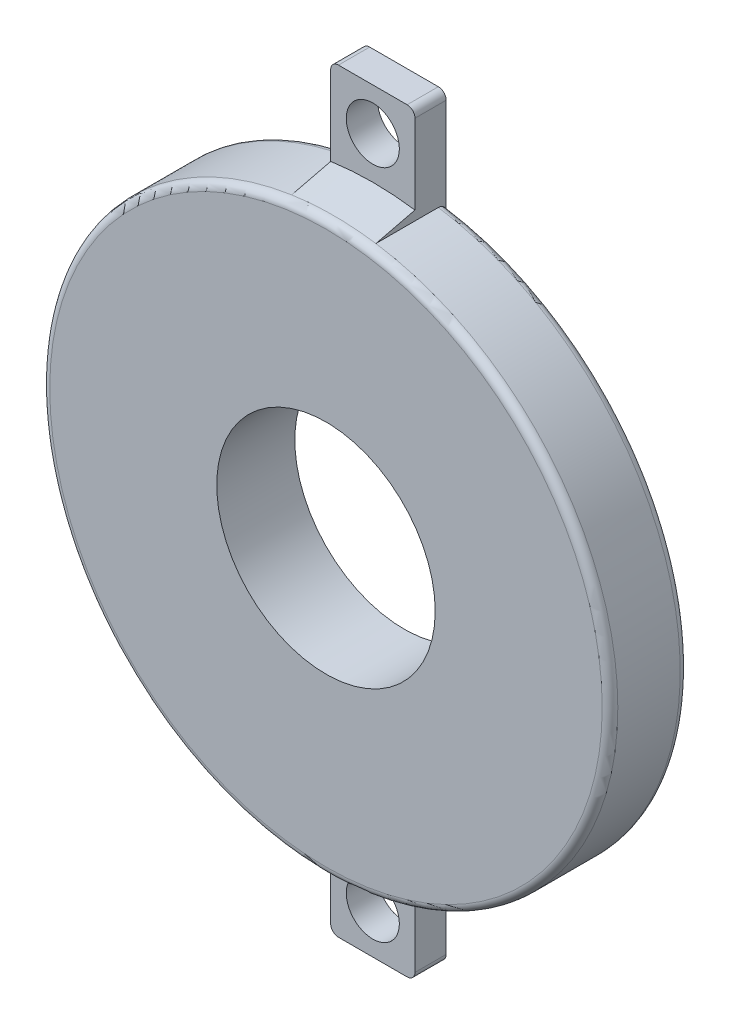
ISO-10303-21;
HEADER;
FILE_DESCRIPTION(('STEP AP214'),'2;1');
FILE_NAME('part.step','',(''),(''),'','','');
FILE_SCHEMA(('AUTOMOTIVE_DESIGN { 1 0 10303 214 1 1 1 1 }'));
ENDSEC;
DATA;
#1=APPLICATION_CONTEXT('core data for automotive mechanical design processes');
#2=APPLICATION_PROTOCOL_DEFINITION('international standard','automotive_design',2000,#1);
#3=PRODUCT_CONTEXT('',#1,'mechanical');
#4=PRODUCT('Part','Part','',(#3));
#5=PRODUCT_RELATED_PRODUCT_CATEGORY('part','',(#4));
#6=PRODUCT_DEFINITION_FORMATION('','',#4);
#7=PRODUCT_DEFINITION_CONTEXT('part definition',#1,'design');
#8=PRODUCT_DEFINITION('design','',#6,#7);
#9=PRODUCT_DEFINITION_SHAPE('','',#8);
#10=(LENGTH_UNIT() NAMED_UNIT(*) SI_UNIT(.MILLI.,.METRE.));
#11=(NAMED_UNIT(*) PLANE_ANGLE_UNIT() SI_UNIT($,.RADIAN.));
#12=(NAMED_UNIT(*) SI_UNIT($,.STERADIAN.) SOLID_ANGLE_UNIT());
#13=UNCERTAINTY_MEASURE_WITH_UNIT(LENGTH_MEASURE(1.E-05),#10,'distance_accuracy_value','');
#14=(GEOMETRIC_REPRESENTATION_CONTEXT(3) GLOBAL_UNCERTAINTY_ASSIGNED_CONTEXT((#13)) GLOBAL_UNIT_ASSIGNED_CONTEXT((#10,
#11,#12)) REPRESENTATION_CONTEXT('',''));
#15=CARTESIAN_POINT('',(0.,0.,0.));
#16=DIRECTION('',(0.,0.,1.));
#17=DIRECTION('',(1.,0.,0.));
#18=AXIS2_PLACEMENT_3D('',#15,#16,#17);
#19=CARTESIAN_POINT('',(0.,0.,5.));
#20=DIRECTION('',(0.,0.,-1.));
#21=DIRECTION('',(-1.,0.,0.));
#22=AXIS2_PLACEMENT_3D('',#19,#20,#21);
#23=CYLINDRICAL_SURFACE('',#22,18.2);
#24=CARTESIAN_POINT('',(0.,0.,4.5));
#25=DIRECTION('',(0.,0.,1.));
#26=DIRECTION('',(1.,0.,0.));
#27=AXIS2_PLACEMENT_3D('',#24,#25,#26);
#28=CIRCLE('',#27,18.2);
#29=CARTESIAN_POINT('',(-2.7,-17.9986110575233,4.5));
#30=VERTEX_POINT('',#29);
#31=CARTESIAN_POINT('',(-2.7,17.9986110575233,4.5));
#32=VERTEX_POINT('',#31);
#33=EDGE_CURVE('E313',#30,#32,#28,.F.);
#34=ORIENTED_EDGE('',*,*,#33,.T.);
#35=DIRECTION('',(0.,0.,-1.));
#36=VECTOR('',#35,1.);
#37=CARTESIAN_POINT('',(-2.7,17.9986110575233,2.));
#38=LINE('',#37,#36);
#39=CARTESIAN_POINT('',(-2.7,17.9986110575233,0.5));
#40=VERTEX_POINT('',#39);
#41=EDGE_CURVE('E237',#32,#40,#38,.T.);
#42=ORIENTED_EDGE('',*,*,#41,.T.);
#43=CARTESIAN_POINT('',(0.,0.,0.5));
#44=DIRECTION('',(0.,0.,1.));
#45=DIRECTION('',(1.,0.,0.));
#46=AXIS2_PLACEMENT_3D('',#43,#44,#45);
#47=CIRCLE('',#46,18.2);
#48=CARTESIAN_POINT('',(-2.7,-17.9986110575233,0.5));
#49=VERTEX_POINT('',#48);
#50=EDGE_CURVE('E312',#40,#49,#47,.T.);
#51=ORIENTED_EDGE('',*,*,#50,.T.);
#52=DIRECTION('',(0.,0.,-1.));
#53=VECTOR('',#52,1.);
#54=CARTESIAN_POINT('',(-2.7,-17.9986110575233,2.));
#55=LINE('',#54,#53);
#56=EDGE_CURVE('E215',#30,#49,#55,.T.);
#57=ORIENTED_EDGE('',*,*,#56,.F.);
#58=EDGE_LOOP('',(#34,#42,#51,#57));
#59=FACE_BOUND('',#58,.T.);
#60=ADVANCED_FACE('F49',(#59),#23,.T.);
#61=DIRECTION('',(0.,0.,-1.));
#62=VECTOR('',#61,1.);
#63=CARTESIAN_POINT('',(2.7,17.9986110575233,2.));
#64=LINE('',#63,#62);
#65=CARTESIAN_POINT('',(2.7,17.9986110575233,4.5));
#66=VERTEX_POINT('',#65);
#67=CARTESIAN_POINT('',(2.7,17.9986110575233,0.5));
#68=VERTEX_POINT('',#67);
#69=EDGE_CURVE('E255',#66,#68,#64,.T.);
#70=ORIENTED_EDGE('',*,*,#69,.F.);
#71=CARTESIAN_POINT('',(2.7,-17.9986110575233,4.5));
#72=VERTEX_POINT('',#71);
#73=EDGE_CURVE('E307',#66,#72,#28,.F.);
#74=ORIENTED_EDGE('',*,*,#73,.T.);
#75=DIRECTION('',(0.,0.,-1.));
#76=VECTOR('',#75,1.);
#77=CARTESIAN_POINT('',(2.7,-17.9986110575233,2.));
#78=LINE('',#77,#76);
#79=CARTESIAN_POINT('',(2.7,-17.9986110575233,0.5));
#80=VERTEX_POINT('',#79);
#81=EDGE_CURVE('E211',#72,#80,#78,.T.);
#82=ORIENTED_EDGE('',*,*,#81,.T.);
#83=CARTESIAN_POINT('',(0.,0.,0.5));
#84=DIRECTION('',(0.,0.,1.));
#85=DIRECTION('',(1.,0.,0.));
#86=AXIS2_PLACEMENT_3D('',#83,#84,#85);
#87=CIRCLE('',#86,18.2);
#88=EDGE_CURVE('E317',#80,#68,#87,.T.);
#89=ORIENTED_EDGE('',*,*,#88,.T.);
#90=EDGE_LOOP('',(#70,#74,#82,#89));
#91=FACE_BOUND('',#90,.T.);
#92=ADVANCED_FACE('F422',(#91),#23,.T.);
#93=CARTESIAN_POINT('',(0.,0.,5.));
#94=DIRECTION('',(0.,0.,-1.));
#95=DIRECTION('',(-1.,0.,0.));
#96=AXIS2_PLACEMENT_3D('',#93,#94,#95);
#97=CYLINDRICAL_SURFACE('',#96,7.);
#98=CARTESIAN_POINT('',(0.,0.,5.));
#99=DIRECTION('',(0.,0.,1.));
#100=DIRECTION('',(1.,0.,0.));
#101=AXIS2_PLACEMENT_3D('',#98,#99,#100);
#102=CIRCLE('',#101,7.);
#103=CARTESIAN_POINT('',(7.,0.,5.));
#104=VERTEX_POINT('',#103);
#105=EDGE_CURVE('E191',#104,#104,#102,.T.);
#106=ORIENTED_EDGE('',*,*,#105,.T.);
#107=EDGE_LOOP('',(#106));
#108=FACE_BOUND('',#107,.T.);
#109=CARTESIAN_POINT('',(0.,0.,0.));
#110=DIRECTION('',(0.,0.,1.));
#111=DIRECTION('',(1.,0.,0.));
#112=AXIS2_PLACEMENT_3D('',#109,#110,#111);
#113=CIRCLE('',#112,7.);
#114=CARTESIAN_POINT('',(7.,0.,0.));
#115=VERTEX_POINT('',#114);
#116=EDGE_CURVE('E220',#115,#115,#113,.T.);
#117=ORIENTED_EDGE('',*,*,#116,.F.);
#118=EDGE_LOOP('',(#117));
#119=FACE_BOUND('',#118,.T.);
#120=ADVANCED_FACE('F428',(#108,#119),#97,.F.);
#121=CARTESIAN_POINT('',(0.,0.,5.));
#122=DIRECTION('',(0.,0.,1.));
#123=DIRECTION('',(1.,0.,0.));
#124=AXIS2_PLACEMENT_3D('',#121,#122,#123);
#125=PLANE('',#124);
#126=CARTESIAN_POINT('',(0.,0.,5.));
#127=DIRECTION('',(0.,0.,1.));
#128=DIRECTION('',(1.,0.,0.));
#129=AXIS2_PLACEMENT_3D('',#126,#127,#128);
#130=CIRCLE('',#129,17.7);
#131=CARTESIAN_POINT('',(17.7,0.,5.));
#132=VERTEX_POINT('',#131);
#133=EDGE_CURVE('E327',#132,#132,#130,.T.);
#134=ORIENTED_EDGE('',*,*,#133,.T.);
#135=EDGE_LOOP('',(#134));
#136=FACE_BOUND('',#135,.T.);
#137=ORIENTED_EDGE('',*,*,#105,.F.);
#138=EDGE_LOOP('',(#137));
#139=FACE_BOUND('',#138,.T.);
#140=ADVANCED_FACE('F436',(#136,#139),#125,.T.);
#141=CARTESIAN_POINT('',(0.,0.,0.));
#142=DIRECTION('',(0.,0.,1.));
#143=DIRECTION('',(1.,0.,0.));
#144=AXIS2_PLACEMENT_3D('',#141,#142,#143);
#145=PLANE('',#144);
#146=ORIENTED_EDGE('',*,*,#116,.T.);
#147=EDGE_LOOP('',(#146));
#148=FACE_BOUND('',#147,.T.);
#149=DIRECTION('',(0.,1.,0.));
#150=VECTOR('',#149,1.);
#151=CARTESIAN_POINT('',(2.7,0.,0.));
#152=LINE('',#151,#150);
#153=CARTESIAN_POINT('',(2.7,17.4928556845359,0.));
#154=VERTEX_POINT('',#153);
#155=CARTESIAN_POINT('',(2.7,23.7,0.));
#156=VERTEX_POINT('',#155);
#157=EDGE_CURVE('E242',#154,#156,#152,.T.);
#158=ORIENTED_EDGE('',*,*,#157,.F.);
#159=CARTESIAN_POINT('',(0.,0.,0.));
#160=DIRECTION('',(0.,0.,1.));
#161=DIRECTION('',(1.,0.,0.));
#162=AXIS2_PLACEMENT_3D('',#159,#160,#161);
#163=CIRCLE('',#162,17.7);
#164=CARTESIAN_POINT('',(2.7,-17.4928556845359,0.));
#165=VERTEX_POINT('',#164);
#166=EDGE_CURVE('E196',#154,#165,#163,.F.);
#167=ORIENTED_EDGE('',*,*,#166,.T.);
#168=DIRECTION('',(0.,-1.,0.));
#169=VECTOR('',#168,1.);
#170=CARTESIAN_POINT('',(2.7,0.,0.));
#171=LINE('',#170,#169);
#172=CARTESIAN_POINT('',(2.7,-23.7,0.));
#173=VERTEX_POINT('',#172);
#174=EDGE_CURVE('E185',#165,#173,#171,.T.);
#175=ORIENTED_EDGE('',*,*,#174,.T.);
#176=CARTESIAN_POINT('',(2.2,-23.7,0.));
#177=DIRECTION('',(0.,0.,1.));
#178=DIRECTION('',(1.,0.,0.));
#179=AXIS2_PLACEMENT_3D('',#176,#177,#178);
#180=CIRCLE('',#179,0.5);
#181=CARTESIAN_POINT('',(2.2,-24.2,0.));
#182=VERTEX_POINT('',#181);
#183=EDGE_CURVE('E170',#173,#182,#180,.F.);
#184=ORIENTED_EDGE('',*,*,#183,.T.);
#185=DIRECTION('',(-1.,0.,0.));
#186=VECTOR('',#185,1.);
#187=CARTESIAN_POINT('',(0.,-24.2,0.));
#188=LINE('',#187,#186);
#189=CARTESIAN_POINT('',(-2.2,-24.2,0.));
#190=VERTEX_POINT('',#189);
#191=EDGE_CURVE('E200',#182,#190,#188,.T.);
#192=ORIENTED_EDGE('',*,*,#191,.T.);
#193=CARTESIAN_POINT('',(-2.2,-23.7,0.));
#194=DIRECTION('',(0.,0.,1.));
#195=DIRECTION('',(1.,0.,0.));
#196=AXIS2_PLACEMENT_3D('',#193,#194,#195);
#197=CIRCLE('',#196,0.5);
#198=CARTESIAN_POINT('',(-2.7,-23.7,0.));
#199=VERTEX_POINT('',#198);
#200=EDGE_CURVE('E182',#190,#199,#197,.F.);
#201=ORIENTED_EDGE('',*,*,#200,.T.);
#202=DIRECTION('',(0.,1.,0.));
#203=VECTOR('',#202,1.);
#204=CARTESIAN_POINT('',(-2.69999999999999,0.,0.));
#205=LINE('',#204,#203);
#206=CARTESIAN_POINT('',(-2.7,-17.4928556845359,0.));
#207=VERTEX_POINT('',#206);
#208=EDGE_CURVE('E207',#199,#207,#205,.T.);
#209=ORIENTED_EDGE('',*,*,#208,.T.);
#210=CARTESIAN_POINT('',(0.,0.,0.));
#211=DIRECTION('',(0.,0.,1.));
#212=DIRECTION('',(1.,0.,0.));
#213=AXIS2_PLACEMENT_3D('',#210,#211,#212);
#214=CIRCLE('',#213,17.7);
#215=CARTESIAN_POINT('',(-2.7,17.4928556845359,0.));
#216=VERTEX_POINT('',#215);
#217=EDGE_CURVE('E321',#207,#216,#214,.F.);
#218=ORIENTED_EDGE('',*,*,#217,.T.);
#219=DIRECTION('',(0.,-1.,0.));
#220=VECTOR('',#219,1.);
#221=CARTESIAN_POINT('',(-2.69999999999999,0.,0.));
#222=LINE('',#221,#220);
#223=CARTESIAN_POINT('',(-2.7,23.7,0.));
#224=VERTEX_POINT('',#223);
#225=EDGE_CURVE('E226',#224,#216,#222,.T.);
#226=ORIENTED_EDGE('',*,*,#225,.F.);
#227=CARTESIAN_POINT('',(-2.2,23.7,0.));
#228=DIRECTION('',(0.,0.,1.));
#229=DIRECTION('',(1.,0.,0.));
#230=AXIS2_PLACEMENT_3D('',#227,#228,#229);
#231=CIRCLE('',#230,0.5);
#232=CARTESIAN_POINT('',(-2.2,24.2,0.));
#233=VERTEX_POINT('',#232);
#234=EDGE_CURVE('E190',#224,#233,#231,.F.);
#235=ORIENTED_EDGE('',*,*,#234,.T.);
#236=DIRECTION('',(-1.,0.,0.));
#237=VECTOR('',#236,1.);
#238=CARTESIAN_POINT('',(0.,24.2,0.));
#239=LINE('',#238,#237);
#240=CARTESIAN_POINT('',(2.2,24.2,0.));
#241=VERTEX_POINT('',#240);
#242=EDGE_CURVE('E246',#241,#233,#239,.T.);
#243=ORIENTED_EDGE('',*,*,#242,.F.);
#244=CARTESIAN_POINT('',(2.2,23.7,0.));
#245=DIRECTION('',(0.,0.,1.));
#246=DIRECTION('',(1.,0.,0.));
#247=AXIS2_PLACEMENT_3D('',#244,#245,#246);
#248=CIRCLE('',#247,0.5);
#249=EDGE_CURVE('E267',#241,#156,#248,.F.);
#250=ORIENTED_EDGE('',*,*,#249,.T.);
#251=EDGE_LOOP('',(#158,#167,#175,#184,#192,#201,#209,#218,#226,#235,#243,#250));
#252=FACE_BOUND('',#251,.T.);
#253=CARTESIAN_POINT('',(0.,21.5,0.));
#254=DIRECTION('',(0.,0.,1.));
#255=DIRECTION('',(1.,0.,0.));
#256=AXIS2_PLACEMENT_3D('',#253,#254,#255);
#257=CIRCLE('',#256,1.7);
#258=CARTESIAN_POINT('',(1.7,21.5,0.));
#259=VERTEX_POINT('',#258);
#260=EDGE_CURVE('E238',#259,#259,#257,.T.);
#261=ORIENTED_EDGE('',*,*,#260,.T.);
#262=EDGE_LOOP('',(#261));
#263=FACE_BOUND('',#262,.T.);
#264=CARTESIAN_POINT('',(0.,-21.5,0.));
#265=DIRECTION('',(0.,0.,1.));
#266=DIRECTION('',(1.,0.,0.));
#267=AXIS2_PLACEMENT_3D('',#264,#265,#266);
#268=CIRCLE('',#267,1.7);
#269=CARTESIAN_POINT('',(1.7,-21.5,0.));
#270=VERTEX_POINT('',#269);
#271=EDGE_CURVE('E199',#270,#270,#268,.F.);
#272=ORIENTED_EDGE('',*,*,#271,.F.);
#273=EDGE_LOOP('',(#272));
#274=FACE_BOUND('',#273,.T.);
#275=ADVANCED_FACE('F193',(#148,#252,#263,#274),#145,.F.);
#276=CARTESIAN_POINT('',(2.7,0.,2.));
#277=DIRECTION('',(-1.,0.,0.));
#278=DIRECTION('',(0.,-1.,0.));
#279=AXIS2_PLACEMENT_3D('',#276,#277,#278);
#280=PLANE('',#279);
#281=ORIENTED_EDGE('',*,*,#157,.T.);
#282=DIRECTION('',(0.,0.,-1.));
#283=VECTOR('',#282,1.);
#284=CARTESIAN_POINT('',(2.7,23.7,2.));
#285=LINE('',#284,#283);
#286=CARTESIAN_POINT('',(2.7,23.7,2.));
#287=VERTEX_POINT('',#286);
#288=EDGE_CURVE('E293',#156,#287,#285,.F.);
#289=ORIENTED_EDGE('',*,*,#288,.T.);
#290=DIRECTION('',(0.,1.,0.));
#291=VECTOR('',#290,1.);
#292=CARTESIAN_POINT('',(2.7,0.,2.));
#293=LINE('',#292,#291);
#294=CARTESIAN_POINT('',(2.7,18.6051068258153,2.));
#295=VERTEX_POINT('',#294);
#296=EDGE_CURVE('E225',#295,#287,#293,.T.);
#297=ORIENTED_EDGE('',*,*,#296,.F.);
#298=CARTESIAN_POINT('',(2.7,18.6051068258153,2.));
#299=CARTESIAN_POINT('',(2.7,18.5040578988067,2.41667484247021));
#300=CARTESIAN_POINT('',(2.7,18.4029921212794,2.83334559703311));
#301=CARTESIAN_POINT('',(2.7,18.200826865182,3.66667893036639));
#302=CARTESIAN_POINT('',(2.7,18.099727386612,4.08334150913678));
#303=CARTESIAN_POINT('',(2.7,17.9986110575233,4.49999999999985));
#304=B_SPLINE_CURVE_WITH_KNOTS('',3,(#298,#299,#300,#301,#302,#303),.UNSPECIFIED.,.F.,.F.,(4,2,
4),(0.,1.28625785978432,2.57251571963687),.UNSPECIFIED.);
#305=EDGE_CURVE('E401',#295,#66,#304,.T.);
#306=ORIENTED_EDGE('',*,*,#305,.T.);
#307=ORIENTED_EDGE('',*,*,#69,.T.);
#308=CARTESIAN_POINT('',(2.7,17.9986110575233,0.5));
#309=CARTESIAN_POINT('',(2.7,17.9986362127208,0.47209799641883));
#310=CARTESIAN_POINT('',(2.7,17.996250918609,0.444204930384438));
#311=CARTESIAN_POINT('',(2.7,17.9868471977718,0.389241102698077));
#312=CARTESIAN_POINT('',(2.7,17.9798338433778,0.362169474692394));
#313=CARTESIAN_POINT('',(2.7,17.9613575579757,0.309578656384315));
#314=CARTESIAN_POINT('',(2.7,17.949892960694,0.284060051581846));
#315=CARTESIAN_POINT('',(2.7,17.9228650869398,0.235299693897574));
#316=CARTESIAN_POINT('',(2.7,17.9073021781665,0.212057737012114));
#317=CARTESIAN_POINT('',(2.7,17.8724472881876,0.168380775472874));
#318=CARTESIAN_POINT('',(2.7,17.85313789522,0.147959670354429));
#319=CARTESIAN_POINT('',(2.7,17.8113928098569,0.110604425054979));
#320=CARTESIAN_POINT('',(2.7,17.7889564547055,0.0936710259792224));
#321=CARTESIAN_POINT('',(2.7,17.7413444279898,0.0635833937573064));
#322=CARTESIAN_POINT('',(2.7,17.7161420624243,0.0504714485225983));
#323=CARTESIAN_POINT('',(2.7,17.6639131384659,0.0286202727272674));
#324=CARTESIAN_POINT('',(2.7,17.6368873505865,0.0198792081596174));
#325=CARTESIAN_POINT('',(2.7,17.5902514231565,0.00897027506861283));
#326=CARTESIAN_POINT('',(2.7,17.5709116938942,0.00560829024466924));
#327=CARTESIAN_POINT('',(2.7,17.5320022738863,0.00112329522581852));
#328=CARTESIAN_POINT('',(2.7,17.5124329496196,-2.89486353918715E-06));
#329=CARTESIAN_POINT('',(2.7,17.4928556845359,0.));
#330=B_SPLINE_CURVE_WITH_KNOTS('',3,(#308,#309,#310,#311,#312,#313,#314,#315,#316,#317,#318,
#319,#320,#321,#322,#323,#324,#325,#326,#327,#328,#329),.UNSPECIFIED.,.F.,.F.,(4,2,2,2,2,2,2,2,
2,2,4),(0.,0.0835910875238667,0.167090711448585,0.250621622717445,0.334145042169182,
0.418066359538156,0.502005491054527,0.586840990231894,0.671640862782297,0.730408460225355,
0.789092414471551),.UNSPECIFIED.);
#331=EDGE_CURVE('E331',#68,#154,#330,.T.);
#332=ORIENTED_EDGE('',*,*,#331,.T.);
#333=EDGE_LOOP('',(#281,#289,#297,#306,#307,#332));
#334=FACE_BOUND('',#333,.T.);
#335=ADVANCED_FACE('F348',(#334),#280,.F.);
#336=CARTESIAN_POINT('',(0.,24.2,2.));
#337=DIRECTION('',(0.,-1.,0.));
#338=DIRECTION('',(0.,0.,-1.));
#339=AXIS2_PLACEMENT_3D('',#336,#337,#338);
#340=PLANE('',#339);
#341=DIRECTION('',(-1.,0.,0.));
#342=VECTOR('',#341,1.);
#343=CARTESIAN_POINT('',(0.,24.2,2.));
#344=LINE('',#343,#342);
#345=CARTESIAN_POINT('',(2.2,24.2,2.));
#346=VERTEX_POINT('',#345);
#347=CARTESIAN_POINT('',(-2.2,24.2,2.));
#348=VERTEX_POINT('',#347);
#349=EDGE_CURVE('E229',#346,#348,#344,.T.);
#350=ORIENTED_EDGE('',*,*,#349,.F.);
#351=DIRECTION('',(0.,0.,-1.));
#352=VECTOR('',#351,1.);
#353=CARTESIAN_POINT('',(2.2,24.2,2.));
#354=LINE('',#353,#352);
#355=EDGE_CURVE('E289',#346,#241,#354,.T.);
#356=ORIENTED_EDGE('',*,*,#355,.T.);
#357=ORIENTED_EDGE('',*,*,#242,.T.);
#358=DIRECTION('',(0.,0.,-1.));
#359=VECTOR('',#358,1.);
#360=CARTESIAN_POINT('',(-2.2,24.2,2.));
#361=LINE('',#360,#359);
#362=EDGE_CURVE('E286',#233,#348,#361,.F.);
#363=ORIENTED_EDGE('',*,*,#362,.T.);
#364=EDGE_LOOP('',(#350,#356,#357,#363));
#365=FACE_BOUND('',#364,.T.);
#366=ADVANCED_FACE('F391',(#365),#340,.F.);
#367=CARTESIAN_POINT('',(0.,21.5,2.));
#368=DIRECTION('',(0.,0.,-1.));
#369=DIRECTION('',(-1.,0.,0.));
#370=AXIS2_PLACEMENT_3D('',#367,#368,#369);
#371=CYLINDRICAL_SURFACE('',#370,1.7);
#372=CARTESIAN_POINT('',(0.,21.5,2.));
#373=DIRECTION('',(0.,0.,1.));
#374=DIRECTION('',(1.,0.,0.));
#375=AXIS2_PLACEMENT_3D('',#372,#373,#374);
#376=CIRCLE('',#375,1.7);
#377=CARTESIAN_POINT('',(1.7,21.5,2.));
#378=VERTEX_POINT('',#377);
#379=EDGE_CURVE('E221',#378,#378,#376,.T.);
#380=ORIENTED_EDGE('',*,*,#379,.T.);
#381=EDGE_LOOP('',(#380));
#382=FACE_BOUND('',#381,.T.);
#383=ORIENTED_EDGE('',*,*,#260,.F.);
#384=EDGE_LOOP('',(#383));
#385=FACE_BOUND('',#384,.T.);
#386=ADVANCED_FACE('F389',(#382,#385),#371,.F.);
#387=CARTESIAN_POINT('',(-2.69999999999999,0.,2.));
#388=DIRECTION('',(1.,0.,0.));
#389=DIRECTION('',(0.,1.,0.));
#390=AXIS2_PLACEMENT_3D('',#387,#388,#389);
#391=PLANE('',#390);
#392=DIRECTION('',(0.,-1.,0.));
#393=VECTOR('',#392,1.);
#394=CARTESIAN_POINT('',(-2.69999999999999,0.,2.));
#395=LINE('',#394,#393);
#396=CARTESIAN_POINT('',(-2.7,23.7,2.));
#397=VERTEX_POINT('',#396);
#398=CARTESIAN_POINT('',(-2.7,18.6051068258153,2.));
#399=VERTEX_POINT('',#398);
#400=EDGE_CURVE('E233',#397,#399,#395,.T.);
#401=ORIENTED_EDGE('',*,*,#400,.F.);
#402=DIRECTION('',(0.,0.,-1.));
#403=VECTOR('',#402,1.);
#404=CARTESIAN_POINT('',(-2.7,23.7,2.));
#405=LINE('',#404,#403);
#406=EDGE_CURVE('E303',#397,#224,#405,.T.);
#407=ORIENTED_EDGE('',*,*,#406,.T.);
#408=ORIENTED_EDGE('',*,*,#225,.T.);
#409=CARTESIAN_POINT('',(-2.7,17.4928556845359,0.));
#410=CARTESIAN_POINT('',(-2.7,17.5215521800726,-2.28262061123705E-05));
#411=CARTESIAN_POINT('',(-2.7,17.5502437257048,0.00241168089758089));
#412=CARTESIAN_POINT('',(-2.7,17.6068070645712,0.0120312817911211));
#413=CARTESIAN_POINT('',(-2.7,17.6346792057198,0.0192143280394313));
#414=CARTESIAN_POINT('',(-2.7,17.6888364911695,0.0381729646044765));
#415=CARTESIAN_POINT('',(-2.7,17.715120657659,0.0499513519250995));
#416=CARTESIAN_POINT('',(-2.7,17.7653168790499,0.0777736644234937));
#417=CARTESIAN_POINT('',(-2.7,17.7892295917034,0.0938164022617032));
#418=CARTESIAN_POINT('',(-2.7,17.8338592571499,0.129628520146636));
#419=CARTESIAN_POINT('',(-2.7,17.8545933989866,0.149376470929782));
#420=CARTESIAN_POINT('',(-2.7,17.8924119533099,0.192112440686281));
#421=CARTESIAN_POINT('',(-2.7,17.9094957331323,0.215101020166671));
#422=CARTESIAN_POINT('',(-2.7,17.9393263160275,0.263394698042939));
#423=CARTESIAN_POINT('',(-2.7,17.9521176006945,0.288672355187503));
#424=CARTESIAN_POINT('',(-2.7,17.973218559757,0.341024716269631));
#425=CARTESIAN_POINT('',(-2.7,17.9815315809091,0.368098061186976));
#426=CARTESIAN_POINT('',(-2.7,17.991179917375,0.412805035165642));
#427=CARTESIAN_POINT('',(-2.7,17.9939649775455,0.430139009803402));
#428=CARTESIAN_POINT('',(-2.7,17.9976801303384,0.464979370279541));
#429=CARTESIAN_POINT('',(-2.7,17.9986128813373,0.482485472744648));
#430=CARTESIAN_POINT('',(-2.7,17.9986110575233,0.5));
#431=B_SPLINE_CURVE_WITH_KNOTS('',3,(#409,#410,#411,#412,#413,#414,#415,#416,#417,#418,#419,
#420,#421,#422,#423,#424,#425,#426,#427,#428,#429,#430),.UNSPECIFIED.,.F.,.F.,(4,2,2,2,2,2,2,2,
2,2,4),(0.,0.0859796975610034,0.171922345354002,0.257917384878766,0.343888505508441,
0.4293769341972,0.514880167356769,0.599467829850453,0.683992189135618,0.736570026182343,
0.789072350459492),.UNSPECIFIED.);
#432=EDGE_CURVE('E374',#216,#40,#431,.T.);
#433=ORIENTED_EDGE('',*,*,#432,.T.);
#434=ORIENTED_EDGE('',*,*,#41,.F.);
#435=CARTESIAN_POINT('',(-2.7,17.9986110575233,4.49999999999985));
#436=CARTESIAN_POINT('',(-2.7,18.099727386612,4.08334150913678));
#437=CARTESIAN_POINT('',(-2.7,18.200826865182,3.66667893036639));
#438=CARTESIAN_POINT('',(-2.7,18.4029921212794,2.83334559703311));
#439=CARTESIAN_POINT('',(-2.7,18.5040578988067,2.41667484247021));
#440=CARTESIAN_POINT('',(-2.7,18.6051068258153,2.));
#441=B_SPLINE_CURVE_WITH_KNOTS('',3,(#435,#436,#437,#438,#439,#440),.UNSPECIFIED.,.F.,.F.,(4,2,
4),(0.,1.28625785985255,2.57251571963687),.UNSPECIFIED.);
#442=EDGE_CURVE('E394',#32,#399,#441,.T.);
#443=ORIENTED_EDGE('',*,*,#442,.T.);
#444=EDGE_LOOP('',(#401,#407,#408,#433,#434,#443));
#445=FACE_BOUND('',#444,.T.);
#446=ADVANCED_FACE('F384',(#445),#391,.F.);
#447=CARTESIAN_POINT('',(0.,0.,2.));
#448=DIRECTION('',(0.,0.,1.));
#449=DIRECTION('',(1.,0.,0.));
#450=AXIS2_PLACEMENT_3D('',#447,#448,#449);
#451=PLANE('',#450);
#452=ORIENTED_EDGE('',*,*,#379,.F.);
#453=EDGE_LOOP('',(#452));
#454=FACE_BOUND('',#453,.T.);
#455=ORIENTED_EDGE('',*,*,#400,.T.);
#456=CARTESIAN_POINT('',(0.,0.,2.));
#457=DIRECTION('',(0.,0.,1.));
#458=DIRECTION('',(1.,0.,0.));
#459=AXIS2_PLACEMENT_3D('',#456,#457,#458);
#460=CIRCLE('',#459,18.8);
#461=EDGE_CURVE('E382',#399,#295,#460,.F.);
#462=ORIENTED_EDGE('',*,*,#461,.T.);
#463=ORIENTED_EDGE('',*,*,#296,.T.);
#464=CARTESIAN_POINT('',(2.2,23.7,2.));
#465=DIRECTION('',(0.,0.,1.));
#466=DIRECTION('',(1.,0.,0.));
#467=AXIS2_PLACEMENT_3D('',#464,#465,#466);
#468=CIRCLE('',#467,0.5);
#469=EDGE_CURVE('E300',#287,#346,#468,.T.);
#470=ORIENTED_EDGE('',*,*,#469,.T.);
#471=ORIENTED_EDGE('',*,*,#349,.T.);
#472=CARTESIAN_POINT('',(-2.2,23.7,2.));
#473=DIRECTION('',(0.,0.,1.));
#474=DIRECTION('',(1.,0.,0.));
#475=AXIS2_PLACEMENT_3D('',#472,#473,#474);
#476=CIRCLE('',#475,0.5);
#477=EDGE_CURVE('E297',#348,#397,#476,.T.);
#478=ORIENTED_EDGE('',*,*,#477,.T.);
#479=EDGE_LOOP('',(#455,#462,#463,#470,#471,#478));
#480=FACE_BOUND('',#479,.T.);
#481=ADVANCED_FACE('F388',(#454,#480),#451,.T.);
#482=CARTESIAN_POINT('',(-2.69999999999999,0.,2.));
#483=DIRECTION('',(-1.,0.,0.));
#484=DIRECTION('',(0.,-1.,0.));
#485=AXIS2_PLACEMENT_3D('',#482,#483,#484);
#486=PLANE('',#485);
#487=ORIENTED_EDGE('',*,*,#208,.F.);
#488=DIRECTION('',(0.,0.,-1.));
#489=VECTOR('',#488,1.);
#490=CARTESIAN_POINT('',(-2.7,-23.7,2.));
#491=LINE('',#490,#489);
#492=CARTESIAN_POINT('',(-2.7,-23.7,2.));
#493=VERTEX_POINT('',#492);
#494=EDGE_CURVE('E283',#199,#493,#491,.F.);
#495=ORIENTED_EDGE('',*,*,#494,.T.);
#496=DIRECTION('',(0.,1.,0.));
#497=VECTOR('',#496,1.);
#498=CARTESIAN_POINT('',(-2.69999999999999,0.,2.));
#499=LINE('',#498,#497);
#500=CARTESIAN_POINT('',(-2.7,-18.6051068258153,2.));
#501=VERTEX_POINT('',#500);
#502=EDGE_CURVE('E205',#493,#501,#499,.T.);
#503=ORIENTED_EDGE('',*,*,#502,.T.);
#504=CARTESIAN_POINT('',(-2.7,-18.6051068258153,2.));
#505=CARTESIAN_POINT('',(-2.7,-18.5040578988067,2.41667484247021));
#506=CARTESIAN_POINT('',(-2.7,-18.4029921212794,2.83334559703311));
#507=CARTESIAN_POINT('',(-2.7,-18.200826865182,3.66667893036639));
#508=CARTESIAN_POINT('',(-2.7,-18.099727386612,4.08334150913678));
#509=CARTESIAN_POINT('',(-2.7,-17.9986110575233,4.49999999999985));
#510=B_SPLINE_CURVE_WITH_KNOTS('',3,(#504,#505,#506,#507,#508,#509),.UNSPECIFIED.,.F.,.F.,(4,2,
4),(0.,1.28625785978432,2.57251571963687),.UNSPECIFIED.);
#511=EDGE_CURVE('E11',#501,#30,#510,.T.);
#512=ORIENTED_EDGE('',*,*,#511,.T.);
#513=ORIENTED_EDGE('',*,*,#56,.T.);
#514=CARTESIAN_POINT('',(-2.7,-17.9986110575233,0.5));
#515=CARTESIAN_POINT('',(-2.7,-17.9986362127209,0.472097996418829));
#516=CARTESIAN_POINT('',(-2.7,-17.9962509186091,0.444204930384438));
#517=CARTESIAN_POINT('',(-2.7,-17.9868471977718,0.389241102698077));
#518=CARTESIAN_POINT('',(-2.7,-17.9798338433778,0.362169474692395));
#519=CARTESIAN_POINT('',(-2.7,-17.9613575579757,0.309578656384316));
#520=CARTESIAN_POINT('',(-2.7,-17.949892960694,0.284060051581847));
#521=CARTESIAN_POINT('',(-2.7,-17.9228650869398,0.235299693897576));
#522=CARTESIAN_POINT('',(-2.7,-17.9073021781665,0.212057737012116));
#523=CARTESIAN_POINT('',(-2.7,-17.8724472881876,0.168380775472876));
#524=CARTESIAN_POINT('',(-2.7,-17.85313789522,0.147959670354431));
#525=CARTESIAN_POINT('',(-2.7,-17.8113928098569,0.11060442505498));
#526=CARTESIAN_POINT('',(-2.7,-17.7889564547055,0.093671025979222));
#527=CARTESIAN_POINT('',(-2.7,-17.7413444279899,0.0635833937573063));
#528=CARTESIAN_POINT('',(-2.7,-17.7161420624244,0.050471448522599));
#529=CARTESIAN_POINT('',(-2.7,-17.6639131384659,0.0286202727272693));
#530=CARTESIAN_POINT('',(-2.7,-17.6368873505865,0.0198792081596198));
#531=CARTESIAN_POINT('',(-2.7,-17.5902514231565,0.00897027506861444));
#532=CARTESIAN_POINT('',(-2.7,-17.5709116938942,0.00560829024467018));
#533=CARTESIAN_POINT('',(-2.7,-17.5320022738863,0.00112329522581874));
#534=CARTESIAN_POINT('',(-2.7,-17.5124329496196,-2.89486353916615E-06));
#535=CARTESIAN_POINT('',(-2.7,-17.4928556845359,0.));
#536=B_SPLINE_CURVE_WITH_KNOTS('',3,(#514,#515,#516,#517,#518,#519,#520,#521,#522,#523,#524,
#525,#526,#527,#528,#529,#530,#531,#532,#533,#534,#535),.UNSPECIFIED.,.F.,.F.,(4,2,2,2,2,2,2,2,
2,2,4),(0.,0.0835910875238662,0.167090711448584,0.250621622717444,0.334145042169179,
0.418066359538153,0.502005491054529,0.586840990231889,0.671640862782287,0.730408460225353,
0.789092414471552),.UNSPECIFIED.);
#537=EDGE_CURVE('E368',#49,#207,#536,.T.);
#538=ORIENTED_EDGE('',*,*,#537,.T.);
#539=EDGE_LOOP('',(#487,#495,#503,#512,#513,#538));
#540=FACE_BOUND('',#539,.T.);
#541=ADVANCED_FACE('F497',(#540),#486,.T.);
#542=CARTESIAN_POINT('',(0.,-24.2,2.));
#543=DIRECTION('',(0.,-1.,0.));
#544=DIRECTION('',(0.,0.,-1.));
#545=AXIS2_PLACEMENT_3D('',#542,#543,#544);
#546=PLANE('',#545);
#547=ORIENTED_EDGE('',*,*,#191,.F.);
#548=DIRECTION('',(0.,0.,-1.));
#549=VECTOR('',#548,1.);
#550=CARTESIAN_POINT('',(2.2,-24.2,2.));
#551=LINE('',#550,#549);
#552=CARTESIAN_POINT('',(2.2,-24.2,2.));
#553=VERTEX_POINT('',#552);
#554=EDGE_CURVE('E175',#182,#553,#551,.F.);
#555=ORIENTED_EDGE('',*,*,#554,.T.);
#556=DIRECTION('',(-1.,0.,0.));
#557=VECTOR('',#556,1.);
#558=CARTESIAN_POINT('',(0.,-24.2,2.));
#559=LINE('',#558,#557);
#560=CARTESIAN_POINT('',(-2.2,-24.2,2.));
#561=VERTEX_POINT('',#560);
#562=EDGE_CURVE('E483',#553,#561,#559,.T.);
#563=ORIENTED_EDGE('',*,*,#562,.T.);
#564=DIRECTION('',(0.,0.,-1.));
#565=VECTOR('',#564,1.);
#566=CARTESIAN_POINT('',(-2.2,-24.2,2.));
#567=LINE('',#566,#565);
#568=EDGE_CURVE('E181',#561,#190,#567,.T.);
#569=ORIENTED_EDGE('',*,*,#568,.T.);
#570=EDGE_LOOP('',(#547,#555,#563,#569));
#571=FACE_BOUND('',#570,.T.);
#572=ADVANCED_FACE('F516',(#571),#546,.T.);
#573=CARTESIAN_POINT('',(2.7,0.,2.));
#574=DIRECTION('',(1.,0.,0.));
#575=DIRECTION('',(0.,1.,0.));
#576=AXIS2_PLACEMENT_3D('',#573,#574,#575);
#577=PLANE('',#576);
#578=ORIENTED_EDGE('',*,*,#81,.F.);
#579=CARTESIAN_POINT('',(2.7,-17.9986110575233,4.49999999999985));
#580=CARTESIAN_POINT('',(2.7,-18.099727386612,4.08334150913678));
#581=CARTESIAN_POINT('',(2.7,-18.200826865182,3.66667893036639));
#582=CARTESIAN_POINT('',(2.7,-18.4029921212794,2.83334559703311));
#583=CARTESIAN_POINT('',(2.7,-18.5040578988067,2.41667484247021));
#584=CARTESIAN_POINT('',(2.7,-18.6051068258153,2.));
#585=B_SPLINE_CURVE_WITH_KNOTS('',3,(#579,#580,#581,#582,#583,#584),.UNSPECIFIED.,.F.,.F.,(4,2,
4),(0.,1.28625785985255,2.57251571963687),.UNSPECIFIED.);
#586=CARTESIAN_POINT('',(2.7,-18.6051068258153,2.));
#587=VERTEX_POINT('',#586);
#588=EDGE_CURVE('E65',#72,#587,#585,.T.);
#589=ORIENTED_EDGE('',*,*,#588,.T.);
#590=DIRECTION('',(0.,-1.,0.));
#591=VECTOR('',#590,1.);
#592=CARTESIAN_POINT('',(2.7,0.,2.));
#593=LINE('',#592,#591);
#594=CARTESIAN_POINT('',(2.7,-23.7,2.));
#595=VERTEX_POINT('',#594);
#596=EDGE_CURVE('E187',#587,#595,#593,.T.);
#597=ORIENTED_EDGE('',*,*,#596,.T.);
#598=DIRECTION('',(0.,0.,-1.));
#599=VECTOR('',#598,1.);
#600=CARTESIAN_POINT('',(2.7,-23.7,2.));
#601=LINE('',#600,#599);
#602=EDGE_CURVE('E174',#595,#173,#601,.T.);
#603=ORIENTED_EDGE('',*,*,#602,.T.);
#604=ORIENTED_EDGE('',*,*,#174,.F.);
#605=CARTESIAN_POINT('',(2.7,-17.4928556845359,0.));
#606=CARTESIAN_POINT('',(2.7,-17.5215521800726,-2.28262061118716E-05));
#607=CARTESIAN_POINT('',(2.7,-17.5502437257048,0.0024116808975809));
#608=CARTESIAN_POINT('',(2.7,-17.6068070645712,0.0120312817911199));
#609=CARTESIAN_POINT('',(2.7,-17.6346792057198,0.0192143280394298));
#610=CARTESIAN_POINT('',(2.7,-17.6888364911695,0.0381729646044757));
#611=CARTESIAN_POINT('',(2.7,-17.715120657659,0.0499513519251));
#612=CARTESIAN_POINT('',(2.7,-17.7653168790499,0.0777736644234934));
#613=CARTESIAN_POINT('',(2.7,-17.7892295917034,0.0938164022617003));
#614=CARTESIAN_POINT('',(2.7,-17.8338592571498,0.129628520146629));
#615=CARTESIAN_POINT('',(2.7,-17.8545933989866,0.149376470929774));
#616=CARTESIAN_POINT('',(2.7,-17.8924119533099,0.192112440686275));
#617=CARTESIAN_POINT('',(2.7,-17.9094957331323,0.215101020166666));
#618=CARTESIAN_POINT('',(2.7,-17.9393263160275,0.263394698042935));
#619=CARTESIAN_POINT('',(2.7,-17.9521176006945,0.288672355187498));
#620=CARTESIAN_POINT('',(2.7,-17.973218559757,0.341024716269625));
#621=CARTESIAN_POINT('',(2.7,-17.9815315809091,0.36809806118697));
#622=CARTESIAN_POINT('',(2.7,-17.991179917375,0.412805035165635));
#623=CARTESIAN_POINT('',(2.7,-17.9939649775455,0.430139009803396));
#624=CARTESIAN_POINT('',(2.7,-17.9976801303384,0.464979370279538));
#625=CARTESIAN_POINT('',(2.7,-17.9986128813373,0.482485472744646));
#626=CARTESIAN_POINT('',(2.7,-17.9986110575233,0.499999999999999));
#627=B_SPLINE_CURVE_WITH_KNOTS('',3,(#605,#606,#607,#608,#609,#610,#611,#612,#613,#614,#615,
#616,#617,#618,#619,#620,#621,#622,#623,#624,#625,#626),.UNSPECIFIED.,.F.,.F.,(4,2,2,2,2,2,2,2,
2,2,4),(0.,0.0859796975609999,0.171922345353998,0.257917384878763,0.343888505508432,
0.429376934197193,0.514880167356761,0.599467829850444,0.683992189135609,0.736570026182337,
0.789072350459489),.UNSPECIFIED.);
#628=EDGE_CURVE('E341',#165,#80,#627,.T.);
#629=ORIENTED_EDGE('',*,*,#628,.T.);
#630=EDGE_LOOP('',(#578,#589,#597,#603,#604,#629));
#631=FACE_BOUND('',#630,.T.);
#632=ADVANCED_FACE('F184',(#631),#577,.T.);
#633=CARTESIAN_POINT('',(0.,-21.5,2.));
#634=DIRECTION('',(0.,0.,-1.));
#635=DIRECTION('',(-1.,0.,0.));
#636=AXIS2_PLACEMENT_3D('',#633,#634,#635);
#637=CYLINDRICAL_SURFACE('',#636,1.7);
#638=CARTESIAN_POINT('',(0.,-21.5,2.));
#639=DIRECTION('',(0.,0.,1.));
#640=DIRECTION('',(1.,0.,0.));
#641=AXIS2_PLACEMENT_3D('',#638,#639,#640);
#642=CIRCLE('',#641,1.7);
#643=CARTESIAN_POINT('',(1.7,-21.5,2.));
#644=VERTEX_POINT('',#643);
#645=EDGE_CURVE('E216',#644,#644,#642,.F.);
#646=ORIENTED_EDGE('',*,*,#645,.F.);
#647=EDGE_LOOP('',(#646));
#648=FACE_BOUND('',#647,.T.);
#649=ORIENTED_EDGE('',*,*,#271,.T.);
#650=EDGE_LOOP('',(#649));
#651=FACE_BOUND('',#650,.T.);
#652=ADVANCED_FACE('F515',(#648,#651),#637,.F.);
#653=CARTESIAN_POINT('',(0.,0.,2.));
#654=DIRECTION('',(0.,0.,1.));
#655=DIRECTION('',(1.,0.,0.));
#656=AXIS2_PLACEMENT_3D('',#653,#654,#655);
#657=PLANE('',#656);
#658=ORIENTED_EDGE('',*,*,#596,.F.);
#659=CARTESIAN_POINT('',(0.,0.,2.));
#660=DIRECTION('',(0.,0.,1.));
#661=DIRECTION('',(1.,0.,0.));
#662=AXIS2_PLACEMENT_3D('',#659,#660,#661);
#663=CIRCLE('',#662,18.8);
#664=EDGE_CURVE('E72',#587,#501,#663,.F.);
#665=ORIENTED_EDGE('',*,*,#664,.T.);
#666=ORIENTED_EDGE('',*,*,#502,.F.);
#667=CARTESIAN_POINT('',(-2.2,-23.7,2.));
#668=DIRECTION('',(0.,0.,1.));
#669=DIRECTION('',(1.,0.,0.));
#670=AXIS2_PLACEMENT_3D('',#667,#668,#669);
#671=CIRCLE('',#670,0.5);
#672=EDGE_CURVE('E277',#493,#561,#671,.T.);
#673=ORIENTED_EDGE('',*,*,#672,.T.);
#674=ORIENTED_EDGE('',*,*,#562,.F.);
#675=CARTESIAN_POINT('',(2.2,-23.7,2.));
#676=DIRECTION('',(0.,0.,1.));
#677=DIRECTION('',(1.,0.,0.));
#678=AXIS2_PLACEMENT_3D('',#675,#676,#677);
#679=CIRCLE('',#678,0.5);
#680=EDGE_CURVE('E280',#553,#595,#679,.T.);
#681=ORIENTED_EDGE('',*,*,#680,.T.);
#682=EDGE_LOOP('',(#658,#665,#666,#673,#674,#681));
#683=FACE_BOUND('',#682,.T.);
#684=ORIENTED_EDGE('',*,*,#645,.T.);
#685=EDGE_LOOP('',(#684));
#686=FACE_BOUND('',#685,.T.);
#687=ADVANCED_FACE('F441',(#683,#686),#657,.T.);
#688=CARTESIAN_POINT('',(2.2,-23.7,2.));
#689=DIRECTION('',(0.,0.,-1.));
#690=DIRECTION('',(-1.,0.,0.));
#691=AXIS2_PLACEMENT_3D('',#688,#689,#690);
#692=CYLINDRICAL_SURFACE('',#691,0.5);
#693=ORIENTED_EDGE('',*,*,#680,.F.);
#694=ORIENTED_EDGE('',*,*,#554,.F.);
#695=ORIENTED_EDGE('',*,*,#183,.F.);
#696=ORIENTED_EDGE('',*,*,#602,.F.);
#697=EDGE_LOOP('',(#693,#694,#695,#696));
#698=FACE_BOUND('',#697,.T.);
#699=ADVANCED_FACE('F173',(#698),#692,.T.);
#700=CARTESIAN_POINT('',(-2.2,-23.7,2.));
#701=DIRECTION('',(0.,0.,-1.));
#702=DIRECTION('',(-1.,0.,0.));
#703=AXIS2_PLACEMENT_3D('',#700,#701,#702);
#704=CYLINDRICAL_SURFACE('',#703,0.5);
#705=ORIENTED_EDGE('',*,*,#672,.F.);
#706=ORIENTED_EDGE('',*,*,#494,.F.);
#707=ORIENTED_EDGE('',*,*,#200,.F.);
#708=ORIENTED_EDGE('',*,*,#568,.F.);
#709=EDGE_LOOP('',(#705,#706,#707,#708));
#710=FACE_BOUND('',#709,.T.);
#711=ADVANCED_FACE('F440',(#710),#704,.T.);
#712=CARTESIAN_POINT('',(2.2,23.7,2.));
#713=DIRECTION('',(0.,0.,-1.));
#714=DIRECTION('',(-1.,0.,0.));
#715=AXIS2_PLACEMENT_3D('',#712,#713,#714);
#716=CYLINDRICAL_SURFACE('',#715,0.5);
#717=ORIENTED_EDGE('',*,*,#469,.F.);
#718=ORIENTED_EDGE('',*,*,#288,.F.);
#719=ORIENTED_EDGE('',*,*,#249,.F.);
#720=ORIENTED_EDGE('',*,*,#355,.F.);
#721=EDGE_LOOP('',(#717,#718,#719,#720));
#722=FACE_BOUND('',#721,.T.);
#723=ADVANCED_FACE('F443',(#722),#716,.T.);
#724=CARTESIAN_POINT('',(-2.2,23.7,2.));
#725=DIRECTION('',(0.,0.,-1.));
#726=DIRECTION('',(-1.,0.,0.));
#727=AXIS2_PLACEMENT_3D('',#724,#725,#726);
#728=CYLINDRICAL_SURFACE('',#727,0.5);
#729=ORIENTED_EDGE('',*,*,#477,.F.);
#730=ORIENTED_EDGE('',*,*,#362,.F.);
#731=ORIENTED_EDGE('',*,*,#234,.F.);
#732=ORIENTED_EDGE('',*,*,#406,.F.);
#733=EDGE_LOOP('',(#729,#730,#731,#732));
#734=FACE_BOUND('',#733,.T.);
#735=ADVANCED_FACE('F358',(#734),#728,.T.);
#736=CARTESIAN_POINT('',(0.,0.,0.5));
#737=DIRECTION('',(0.,0.,1.));
#738=DIRECTION('',(1.,0.,0.));
#739=AXIS2_PLACEMENT_3D('',#736,#737,#738);
#740=TOROIDAL_SURFACE('',#739,17.7,0.5);
#741=ORIENTED_EDGE('',*,*,#628,.F.);
#742=ORIENTED_EDGE('',*,*,#166,.F.);
#743=ORIENTED_EDGE('',*,*,#331,.F.);
#744=ORIENTED_EDGE('',*,*,#88,.F.);
#745=EDGE_LOOP('',(#741,#742,#743,#744));
#746=FACE_BOUND('',#745,.T.);
#747=ADVANCED_FACE('F352',(#746),#740,.T.);
#748=CARTESIAN_POINT('',(0.,0.,0.5));
#749=DIRECTION('',(0.,0.,1.));
#750=DIRECTION('',(1.,0.,0.));
#751=AXIS2_PLACEMENT_3D('',#748,#749,#750);
#752=TOROIDAL_SURFACE('',#751,17.7,0.5);
#753=ORIENTED_EDGE('',*,*,#432,.F.);
#754=ORIENTED_EDGE('',*,*,#217,.F.);
#755=ORIENTED_EDGE('',*,*,#537,.F.);
#756=ORIENTED_EDGE('',*,*,#50,.F.);
#757=EDGE_LOOP('',(#753,#754,#755,#756));
#758=FACE_BOUND('',#757,.T.);
#759=ADVANCED_FACE('F357',(#758),#752,.T.);
#760=CARTESIAN_POINT('',(0.,0.,4.5));
#761=DIRECTION('',(0.,0.,1.));
#762=DIRECTION('',(1.,0.,0.));
#763=AXIS2_PLACEMENT_3D('',#760,#761,#762);
#764=TOROIDAL_SURFACE('',#763,17.7,0.5);
#765=EDGE_CURVE('E308',#72,#30,#28,.F.);
#766=ORIENTED_EDGE('',*,*,#765,.F.);
#767=ORIENTED_EDGE('',*,*,#73,.F.);
#768=EDGE_CURVE('E468',#32,#66,#28,.F.);
#769=ORIENTED_EDGE('',*,*,#768,.F.);
#770=ORIENTED_EDGE('',*,*,#33,.F.);
#771=EDGE_LOOP('',(#766,#767,#769,#770));
#772=FACE_BOUND('',#771,.T.);
#773=ORIENTED_EDGE('',*,*,#133,.F.);
#774=EDGE_LOOP('',(#773));
#775=FACE_BOUND('',#774,.T.);
#776=ADVANCED_FACE('F365',(#772,#775),#764,.T.);
#777=CARTESIAN_POINT('',(0.,0.,4.49999999999985));
#778=DIRECTION('',(0.,0.,-1.));
#779=DIRECTION('',(-1.,0.,0.));
#780=AXIS2_PLACEMENT_3D('',#777,#778,#779);
#781=CONICAL_SURFACE('',#780,18.2,0.235544980720866);
#782=ORIENTED_EDGE('',*,*,#305,.F.);
#783=ORIENTED_EDGE('',*,*,#461,.F.);
#784=ORIENTED_EDGE('',*,*,#442,.F.);
#785=ORIENTED_EDGE('',*,*,#768,.T.);
#786=EDGE_LOOP('',(#782,#783,#784,#785));
#787=FACE_BOUND('',#786,.T.);
#788=ADVANCED_FACE('F407',(#787),#781,.T.);
#789=CARTESIAN_POINT('',(0.,0.,4.49999999999985));
#790=DIRECTION('',(0.,0.,-1.));
#791=DIRECTION('',(-1.,0.,0.));
#792=AXIS2_PLACEMENT_3D('',#789,#790,#791);
#793=CONICAL_SURFACE('',#792,18.2,0.235544980720866);
#794=ORIENTED_EDGE('',*,*,#511,.F.);
#795=ORIENTED_EDGE('',*,*,#664,.F.);
#796=ORIENTED_EDGE('',*,*,#588,.F.);
#797=ORIENTED_EDGE('',*,*,#765,.T.);
#798=EDGE_LOOP('',(#794,#795,#796,#797));
#799=FACE_BOUND('',#798,.T.);
#800=ADVANCED_FACE('F52',(#799),#793,.T.);
#801=CLOSED_SHELL('',(#60,#92,#120,#140,#275,#335,#366,#386,#446,#481,#541,#572,#632,#652,#687,
#699,#711,#723,#735,#747,#759,#776,#788,#800));
#802=MANIFOLD_SOLID_BREP('B2',#801);
#803=ADVANCED_BREP_SHAPE_REPRESENTATION('',(#18,#802),#14);
#804=SHAPE_DEFINITION_REPRESENTATION(#9,#803);
ENDSEC;
END-ISO-10303-21;
